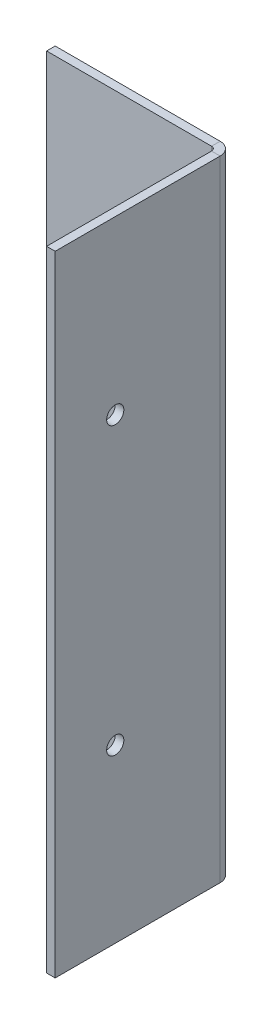
ISO-10303-21;
HEADER;
FILE_DESCRIPTION(('STEP AP214'),'2;1');
FILE_NAME('part.step','',(''),(''),'','','');
FILE_SCHEMA(('AUTOMOTIVE_DESIGN { 1 0 10303 214 1 1 1 1 }'));
ENDSEC;
DATA;
#1=APPLICATION_CONTEXT('core data for automotive mechanical design processes');
#2=APPLICATION_PROTOCOL_DEFINITION('international standard','automotive_design',2000,#1);
#3=PRODUCT_CONTEXT('',#1,'mechanical');
#4=PRODUCT('Part','Part','',(#3));
#5=PRODUCT_RELATED_PRODUCT_CATEGORY('part','',(#4));
#6=PRODUCT_DEFINITION_FORMATION('','',#4);
#7=PRODUCT_DEFINITION_CONTEXT('part definition',#1,'design');
#8=PRODUCT_DEFINITION('design','',#6,#7);
#9=PRODUCT_DEFINITION_SHAPE('','',#8);
#10=(LENGTH_UNIT() NAMED_UNIT(*) SI_UNIT(.MILLI.,.METRE.));
#11=(NAMED_UNIT(*) PLANE_ANGLE_UNIT() SI_UNIT($,.RADIAN.));
#12=(NAMED_UNIT(*) SI_UNIT($,.STERADIAN.) SOLID_ANGLE_UNIT());
#13=UNCERTAINTY_MEASURE_WITH_UNIT(LENGTH_MEASURE(1.E-05),#10,'distance_accuracy_value','');
#14=(GEOMETRIC_REPRESENTATION_CONTEXT(3) GLOBAL_UNCERTAINTY_ASSIGNED_CONTEXT((#13)) GLOBAL_UNIT_ASSIGNED_CONTEXT((#10,
#11,#12)) REPRESENTATION_CONTEXT('',''));
#15=CARTESIAN_POINT('',(0.,0.,0.));
#16=DIRECTION('',(0.,0.,1.));
#17=DIRECTION('',(1.,0.,0.));
#18=AXIS2_PLACEMENT_3D('',#15,#16,#17);
#19=CARTESIAN_POINT('',(29.5690270902935,0.,-30.4309729097067));
#20=DIRECTION('',(1.,0.,0.));
#21=DIRECTION('',(0.,0.,-1.));
#22=AXIS2_PLACEMENT_3D('',#19,#20,#21);
#23=PLANE('',#22);
#24=CARTESIAN_POINT('',(29.5690270902933,80.,19.0670308100559));
#25=DIRECTION('',(-1.,0.,0.));
#26=DIRECTION('',(0.,0.,1.));
#27=AXIS2_PLACEMENT_3D('',#24,#25,#26);
#28=CIRCLE('',#27,1.5);
#29=CARTESIAN_POINT('',(29.5690270902933,80.,20.5670308100559));
#30=VERTEX_POINT('',#29);
#31=EDGE_CURVE('E381',#30,#30,#28,.T.);
#32=ORIENTED_EDGE('',*,*,#31,.F.);
#33=EDGE_LOOP('',(#32));
#34=FACE_BOUND('',#33,.T.);
#35=CARTESIAN_POINT('',(29.5690270902933,30.,19.0670308100559));
#36=DIRECTION('',(-1.,0.,0.));
#37=DIRECTION('',(0.,0.,1.));
#38=AXIS2_PLACEMENT_3D('',#35,#36,#37);
#39=CIRCLE('',#38,1.5);
#40=CARTESIAN_POINT('',(29.5690270902933,30.,20.5670308100559));
#41=VERTEX_POINT('',#40);
#42=EDGE_CURVE('E383',#41,#41,#39,.T.);
#43=ORIENTED_EDGE('',*,*,#42,.F.);
#44=EDGE_LOOP('',(#43));
#45=FACE_BOUND('',#44,.T.);
#46=DIRECTION('',(0.,0.,-1.));
#47=VECTOR('',#46,1.);
#48=CARTESIAN_POINT('',(29.5690270902934,110.,-30.4309729097066));
#49=LINE('',#48,#47);
#50=CARTESIAN_POINT('',(29.5690270902932,110.,29.5690270902934));
#51=VERTEX_POINT('',#50);
#52=CARTESIAN_POINT('',(29.5690270902933,110.,0.736600000000014));
#53=VERTEX_POINT('',#52);
#54=EDGE_CURVE('E57',#51,#53,#49,.T.);
#55=ORIENTED_EDGE('',*,*,#54,.T.);
#56=DIRECTION('',(0.,-1.,0.));
#57=VECTOR('',#56,1.);
#58=CARTESIAN_POINT('',(29.5690270902934,0.,0.736600000000007));
#59=LINE('',#58,#57);
#60=CARTESIAN_POINT('',(29.5690270902934,0.,0.7366));
#61=VERTEX_POINT('',#60);
#62=EDGE_CURVE('E49',#53,#61,#59,.T.);
#63=ORIENTED_EDGE('',*,*,#62,.T.);
#64=DIRECTION('',(0.,0.,1.));
#65=VECTOR('',#64,1.);
#66=CARTESIAN_POINT('',(29.5690270902935,0.,-30.4309729097067));
#67=LINE('',#66,#65);
#68=CARTESIAN_POINT('',(29.5690270902933,0.,29.5690270902933));
#69=VERTEX_POINT('',#68);
#70=EDGE_CURVE('E65',#61,#69,#67,.T.);
#71=ORIENTED_EDGE('',*,*,#70,.T.);
#72=DIRECTION('',(0.,1.,0.));
#73=VECTOR('',#72,1.);
#74=CARTESIAN_POINT('',(29.5690270902933,0.,29.5690270902933));
#75=LINE('',#74,#73);
#76=EDGE_CURVE('E155',#69,#51,#75,.T.);
#77=ORIENTED_EDGE('',*,*,#76,.T.);
#78=EDGE_LOOP('',(#55,#63,#71,#77));
#79=FACE_BOUND('',#78,.T.);
#80=ADVANCED_FACE('F40',(#34,#45,#79),#23,.F.);
#81=CARTESIAN_POINT('',(31.0690270902935,110.,-30.4309729097066));
#82=DIRECTION('',(0.,1.,0.));
#83=DIRECTION('',(-1.,0.,0.));
#84=AXIS2_PLACEMENT_3D('',#81,#82,#83);
#85=PLANE('',#84);
#86=DIRECTION('',(1.,0.,0.));
#87=VECTOR('',#86,1.);
#88=CARTESIAN_POINT('',(31.0690270902933,110.,0.736600000000014));
#89=LINE('',#88,#87);
#90=CARTESIAN_POINT('',(31.0690270902933,110.,0.736600000000021));
#91=VERTEX_POINT('',#90);
#92=EDGE_CURVE('E12',#53,#91,#89,.T.);
#93=ORIENTED_EDGE('',*,*,#92,.F.);
#94=ORIENTED_EDGE('',*,*,#54,.F.);
#95=DIRECTION('',(-1.,0.,0.));
#96=VECTOR('',#95,1.);
#97=CARTESIAN_POINT('',(31.0690270902932,110.,29.5690270902934));
#98=LINE('',#97,#96);
#99=CARTESIAN_POINT('',(31.0690270902932,110.,29.5690270902934));
#100=VERTEX_POINT('',#99);
#101=EDGE_CURVE('E157',#100,#51,#98,.T.);
#102=ORIENTED_EDGE('',*,*,#101,.F.);
#103=DIRECTION('',(0.,0.,-1.));
#104=VECTOR('',#103,1.);
#105=CARTESIAN_POINT('',(31.0690270902935,110.,-30.4309729097066));
#106=LINE('',#105,#104);
#107=EDGE_CURVE('E154',#100,#91,#106,.T.);
#108=ORIENTED_EDGE('',*,*,#107,.T.);
#109=EDGE_LOOP('',(#93,#94,#102,#108));
#110=FACE_BOUND('',#109,.T.);
#111=ADVANCED_FACE('F42',(#110),#85,.T.);
#112=CARTESIAN_POINT('',(31.0690270902933,0.,29.5690270902933));
#113=DIRECTION('',(0.,0.,1.));
#114=DIRECTION('',(1.,0.,0.));
#115=AXIS2_PLACEMENT_3D('',#112,#113,#114);
#116=PLANE('',#115);
#117=ORIENTED_EDGE('',*,*,#76,.F.);
#118=DIRECTION('',(-1.,0.,0.));
#119=VECTOR('',#118,1.);
#120=CARTESIAN_POINT('',(31.0690270902933,0.,29.5690270902933));
#121=LINE('',#120,#119);
#122=CARTESIAN_POINT('',(31.0690270902933,0.,29.5690270902933));
#123=VERTEX_POINT('',#122);
#124=EDGE_CURVE('E159',#123,#69,#121,.T.);
#125=ORIENTED_EDGE('',*,*,#124,.F.);
#126=DIRECTION('',(0.,1.,0.));
#127=VECTOR('',#126,1.);
#128=CARTESIAN_POINT('',(31.0690270902933,0.,29.5690270902933));
#129=LINE('',#128,#127);
#130=EDGE_CURVE('E151',#123,#100,#129,.T.);
#131=ORIENTED_EDGE('',*,*,#130,.T.);
#132=ORIENTED_EDGE('',*,*,#101,.T.);
#133=EDGE_LOOP('',(#117,#125,#131,#132));
#134=FACE_BOUND('',#133,.T.);
#135=ADVANCED_FACE('F175',(#134),#116,.T.);
#136=CARTESIAN_POINT('',(31.0690270902935,0.,-30.4309729097066));
#137=DIRECTION('',(0.,-1.,0.));
#138=DIRECTION('',(1.,0.,0.));
#139=AXIS2_PLACEMENT_3D('',#136,#137,#138);
#140=PLANE('',#139);
#141=DIRECTION('',(-1.,0.,0.));
#142=VECTOR('',#141,1.);
#143=CARTESIAN_POINT('',(31.0690270902934,0.,0.736600000000014));
#144=LINE('',#143,#142);
#145=CARTESIAN_POINT('',(31.0690270902934,0.,0.736599999999997));
#146=VERTEX_POINT('',#145);
#147=EDGE_CURVE('E162',#146,#61,#144,.T.);
#148=ORIENTED_EDGE('',*,*,#147,.F.);
#149=DIRECTION('',(0.,0.,1.));
#150=VECTOR('',#149,1.);
#151=CARTESIAN_POINT('',(31.0690270902935,0.,-30.4309729097066));
#152=LINE('',#151,#150);
#153=EDGE_CURVE('E44',#146,#123,#152,.T.);
#154=ORIENTED_EDGE('',*,*,#153,.T.);
#155=ORIENTED_EDGE('',*,*,#124,.T.);
#156=ORIENTED_EDGE('',*,*,#70,.F.);
#157=EDGE_LOOP('',(#148,#154,#155,#156));
#158=FACE_BOUND('',#157,.T.);
#159=ADVANCED_FACE('F170',(#158),#140,.T.);
#160=CARTESIAN_POINT('',(31.0690270902935,0.,-30.4309729097066));
#161=DIRECTION('',(1.,0.,0.));
#162=DIRECTION('',(0.,0.,-1.));
#163=AXIS2_PLACEMENT_3D('',#160,#161,#162);
#164=PLANE('',#163);
#165=CARTESIAN_POINT('',(31.0690270902934,80.,19.0670308100559));
#166=DIRECTION('',(-1.,0.,0.));
#167=DIRECTION('',(0.,0.,1.));
#168=AXIS2_PLACEMENT_3D('',#165,#166,#167);
#169=CIRCLE('',#168,1.5);
#170=CARTESIAN_POINT('',(31.0690270902934,80.,20.5670308100559));
#171=VERTEX_POINT('',#170);
#172=EDGE_CURVE('E379',#171,#171,#169,.T.);
#173=ORIENTED_EDGE('',*,*,#172,.T.);
#174=EDGE_LOOP('',(#173));
#175=FACE_BOUND('',#174,.T.);
#176=CARTESIAN_POINT('',(31.0690270902934,30.,19.0670308100559));
#177=DIRECTION('',(-1.,0.,0.));
#178=DIRECTION('',(0.,0.,1.));
#179=AXIS2_PLACEMENT_3D('',#176,#177,#178);
#180=CIRCLE('',#179,1.5);
#181=CARTESIAN_POINT('',(31.0690270902934,30.,20.5670308100559));
#182=VERTEX_POINT('',#181);
#183=EDGE_CURVE('E188',#182,#182,#180,.T.);
#184=ORIENTED_EDGE('',*,*,#183,.T.);
#185=EDGE_LOOP('',(#184));
#186=FACE_BOUND('',#185,.T.);
#187=DIRECTION('',(0.,-1.,0.));
#188=VECTOR('',#187,1.);
#189=CARTESIAN_POINT('',(31.0690270902934,0.,0.736600000000014));
#190=LINE('',#189,#188);
#191=EDGE_CURVE('E129',#91,#146,#190,.T.);
#192=ORIENTED_EDGE('',*,*,#191,.F.);
#193=ORIENTED_EDGE('',*,*,#107,.F.);
#194=ORIENTED_EDGE('',*,*,#130,.F.);
#195=ORIENTED_EDGE('',*,*,#153,.F.);
#196=EDGE_LOOP('',(#192,#193,#194,#195));
#197=FACE_BOUND('',#196,.T.);
#198=ADVANCED_FACE('F177',(#175,#186,#197),#164,.T.);
#199=CARTESIAN_POINT('',(0.,0.,-1.5));
#200=DIRECTION('',(-1.,0.,0.));
#201=DIRECTION('',(0.,0.,1.));
#202=AXIS2_PLACEMENT_3D('',#199,#200,#201);
#203=PLANE('',#202);
#204=DIRECTION('',(0.,-1.,0.));
#205=VECTOR('',#204,1.);
#206=CARTESIAN_POINT('',(0.,0.,0.));
#207=LINE('',#206,#205);
#208=CARTESIAN_POINT('',(0.,110.,0.));
#209=VERTEX_POINT('',#208);
#210=CARTESIAN_POINT('',(0.,0.,0.));
#211=VERTEX_POINT('',#210);
#212=EDGE_CURVE('E200',#209,#211,#207,.T.);
#213=ORIENTED_EDGE('',*,*,#212,.F.);
#214=DIRECTION('',(0.,0.,1.));
#215=VECTOR('',#214,1.);
#216=CARTESIAN_POINT('',(0.,110.,-1.5));
#217=LINE('',#216,#215);
#218=CARTESIAN_POINT('',(0.,110.,-1.5));
#219=VERTEX_POINT('',#218);
#220=EDGE_CURVE('E167',#219,#209,#217,.T.);
#221=ORIENTED_EDGE('',*,*,#220,.F.);
#222=DIRECTION('',(0.,-1.,0.));
#223=VECTOR('',#222,1.);
#224=CARTESIAN_POINT('',(0.,0.,-1.5));
#225=LINE('',#224,#223);
#226=CARTESIAN_POINT('',(0.,0.,-1.5));
#227=VERTEX_POINT('',#226);
#228=EDGE_CURVE('E148',#219,#227,#225,.T.);
#229=ORIENTED_EDGE('',*,*,#228,.T.);
#230=DIRECTION('',(0.,0.,1.));
#231=VECTOR('',#230,1.);
#232=CARTESIAN_POINT('',(0.,0.,-1.5));
#233=LINE('',#232,#231);
#234=EDGE_CURVE('E141',#227,#211,#233,.T.);
#235=ORIENTED_EDGE('',*,*,#234,.T.);
#236=EDGE_LOOP('',(#213,#221,#229,#235));
#237=FACE_BOUND('',#236,.T.);
#238=ADVANCED_FACE('F211',(#237),#203,.T.);
#239=CARTESIAN_POINT('',(0.,0.,-1.5));
#240=DIRECTION('',(0.,0.,-1.));
#241=DIRECTION('',(-1.,0.,0.));
#242=AXIS2_PLACEMENT_3D('',#239,#240,#241);
#243=PLANE('',#242);
#244=DIRECTION('',(-1.,0.,0.));
#245=VECTOR('',#244,1.);
#246=CARTESIAN_POINT('',(0.,110.,-1.5));
#247=LINE('',#246,#245);
#248=CARTESIAN_POINT('',(28.8324270902934,110.,-1.5));
#249=VERTEX_POINT('',#248);
#250=EDGE_CURVE('E139',#249,#219,#247,.T.);
#251=ORIENTED_EDGE('',*,*,#250,.F.);
#252=DIRECTION('',(0.,-1.,0.));
#253=VECTOR('',#252,1.);
#254=CARTESIAN_POINT('',(28.8324270902934,0.,-1.5));
#255=LINE('',#254,#253);
#256=CARTESIAN_POINT('',(28.8324270902934,1.11022302462516E-13,-1.5));
#257=VERTEX_POINT('',#256);
#258=EDGE_CURVE('E127',#249,#257,#255,.T.);
#259=ORIENTED_EDGE('',*,*,#258,.T.);
#260=DIRECTION('',(1.,0.,0.));
#261=VECTOR('',#260,1.);
#262=CARTESIAN_POINT('',(0.,0.,-1.5));
#263=LINE('',#262,#261);
#264=EDGE_CURVE('E120',#227,#257,#263,.T.);
#265=ORIENTED_EDGE('',*,*,#264,.F.);
#266=ORIENTED_EDGE('',*,*,#228,.F.);
#267=EDGE_LOOP('',(#251,#259,#265,#266));
#268=FACE_BOUND('',#267,.T.);
#269=ADVANCED_FACE('F136',(#268),#243,.T.);
#270=CARTESIAN_POINT('',(0.,0.,-1.5));
#271=DIRECTION('',(0.,-1.,0.));
#272=DIRECTION('',(0.,0.,-1.));
#273=AXIS2_PLACEMENT_3D('',#270,#271,#272);
#274=PLANE('',#273);
#275=ORIENTED_EDGE('',*,*,#264,.T.);
#276=DIRECTION('',(0.,0.,1.));
#277=VECTOR('',#276,1.);
#278=CARTESIAN_POINT('',(28.8324270902934,0.,-1.5));
#279=LINE('',#278,#277);
#280=CARTESIAN_POINT('',(28.8324270902934,0.,0.));
#281=VERTEX_POINT('',#280);
#282=EDGE_CURVE('E108',#257,#281,#279,.T.);
#283=ORIENTED_EDGE('',*,*,#282,.T.);
#284=DIRECTION('',(1.,0.,0.));
#285=VECTOR('',#284,1.);
#286=CARTESIAN_POINT('',(0.,0.,0.));
#287=LINE('',#286,#285);
#288=EDGE_CURVE('E197',#211,#281,#287,.T.);
#289=ORIENTED_EDGE('',*,*,#288,.F.);
#290=ORIENTED_EDGE('',*,*,#234,.F.);
#291=EDGE_LOOP('',(#275,#283,#289,#290));
#292=FACE_BOUND('',#291,.T.);
#293=ADVANCED_FACE('F143',(#292),#274,.T.);
#294=CARTESIAN_POINT('',(0.,0.,0.));
#295=DIRECTION('',(0.,0.,-1.));
#296=DIRECTION('',(-1.,0.,0.));
#297=AXIS2_PLACEMENT_3D('',#294,#295,#296);
#298=PLANE('',#297);
#299=DIRECTION('',(0.,-1.,0.));
#300=VECTOR('',#299,1.);
#301=CARTESIAN_POINT('',(28.8324270902934,0.,0.));
#302=LINE('',#301,#300);
#303=CARTESIAN_POINT('',(28.8324270902934,110.,0.));
#304=VERTEX_POINT('',#303);
#305=EDGE_CURVE('E130',#304,#281,#302,.T.);
#306=ORIENTED_EDGE('',*,*,#305,.F.);
#307=DIRECTION('',(-1.,0.,0.));
#308=VECTOR('',#307,1.);
#309=CARTESIAN_POINT('',(0.,110.,0.));
#310=LINE('',#309,#308);
#311=EDGE_CURVE('E119',#304,#209,#310,.T.);
#312=ORIENTED_EDGE('',*,*,#311,.T.);
#313=ORIENTED_EDGE('',*,*,#212,.T.);
#314=ORIENTED_EDGE('',*,*,#288,.T.);
#315=EDGE_LOOP('',(#306,#312,#313,#314));
#316=FACE_BOUND('',#315,.T.);
#317=ADVANCED_FACE('F205',(#316),#298,.F.);
#318=CARTESIAN_POINT('',(0.,110.,-1.5));
#319=DIRECTION('',(0.,1.,0.));
#320=DIRECTION('',(0.,0.,1.));
#321=AXIS2_PLACEMENT_3D('',#318,#319,#320);
#322=PLANE('',#321);
#323=ORIENTED_EDGE('',*,*,#311,.F.);
#324=DIRECTION('',(0.,0.,-1.));
#325=VECTOR('',#324,1.);
#326=CARTESIAN_POINT('',(28.8324270902934,110.,-1.5));
#327=LINE('',#326,#325);
#328=EDGE_CURVE('E195',#304,#249,#327,.T.);
#329=ORIENTED_EDGE('',*,*,#328,.T.);
#330=ORIENTED_EDGE('',*,*,#250,.T.);
#331=ORIENTED_EDGE('',*,*,#220,.T.);
#332=EDGE_LOOP('',(#323,#329,#330,#331));
#333=FACE_BOUND('',#332,.T.);
#334=ADVANCED_FACE('F209',(#333),#322,.T.);
#335=CARTESIAN_POINT('',(28.8324270902934,110.,0.7366));
#336=DIRECTION('',(0.,1.,0.));
#337=DIRECTION('',(0.,0.,1.));
#338=AXIS2_PLACEMENT_3D('',#335,#336,#337);
#339=PLANE('',#338);
#340=ORIENTED_EDGE('',*,*,#328,.F.);
#341=CARTESIAN_POINT('',(28.8324270902934,110.,0.7366));
#342=DIRECTION('',(0.,-1.,0.));
#343=DIRECTION('',(1.,0.,0.));
#344=AXIS2_PLACEMENT_3D('',#341,#342,#343);
#345=CIRCLE('',#344,0.7366);
#346=EDGE_CURVE('E184',#304,#53,#345,.T.);
#347=ORIENTED_EDGE('',*,*,#346,.T.);
#348=ORIENTED_EDGE('',*,*,#92,.T.);
#349=CARTESIAN_POINT('',(28.8324270902934,110.,0.7366));
#350=DIRECTION('',(0.,-1.,0.));
#351=DIRECTION('',(0.,0.,1.));
#352=AXIS2_PLACEMENT_3D('',#349,#350,#351);
#353=CIRCLE('',#352,2.2366);
#354=EDGE_CURVE('E131',#249,#91,#353,.T.);
#355=ORIENTED_EDGE('',*,*,#354,.F.);
#356=EDGE_LOOP('',(#340,#347,#348,#355));
#357=FACE_BOUND('',#356,.T.);
#358=ADVANCED_FACE('F182',(#357),#339,.T.);
#359=CARTESIAN_POINT('',(28.8324270902934,0.,0.7366));
#360=DIRECTION('',(0.,-1.,0.));
#361=DIRECTION('',(1.,0.,0.));
#362=AXIS2_PLACEMENT_3D('',#359,#360,#361);
#363=PLANE('',#362);
#364=CARTESIAN_POINT('',(28.8324270902934,1.38777878078145E-13,0.7366));
#365=DIRECTION('',(0.,-1.,0.));
#366=DIRECTION('',(1.,0.,0.));
#367=AXIS2_PLACEMENT_3D('',#364,#365,#366);
#368=CIRCLE('',#367,0.7366);
#369=EDGE_CURVE('E114',#61,#281,#368,.F.);
#370=ORIENTED_EDGE('',*,*,#369,.T.);
#371=ORIENTED_EDGE('',*,*,#282,.F.);
#372=CARTESIAN_POINT('',(28.8324270902934,0.,0.7366));
#373=DIRECTION('',(0.,1.,0.));
#374=DIRECTION('',(1.,0.,0.));
#375=AXIS2_PLACEMENT_3D('',#372,#373,#374);
#376=CIRCLE('',#375,2.2366);
#377=EDGE_CURVE('E112',#146,#257,#376,.T.);
#378=ORIENTED_EDGE('',*,*,#377,.F.);
#379=ORIENTED_EDGE('',*,*,#147,.T.);
#380=EDGE_LOOP('',(#370,#371,#378,#379));
#381=FACE_BOUND('',#380,.T.);
#382=ADVANCED_FACE('F110',(#381),#363,.T.);
#383=CARTESIAN_POINT('',(28.8324270902933,165.035007638469,0.7366));
#384=DIRECTION('',(0.,-1.,0.));
#385=DIRECTION('',(1.,0.,0.));
#386=AXIS2_PLACEMENT_3D('',#383,#384,#385);
#387=CYLINDRICAL_SURFACE('',#386,2.2366);
#388=ORIENTED_EDGE('',*,*,#191,.T.);
#389=ORIENTED_EDGE('',*,*,#377,.T.);
#390=ORIENTED_EDGE('',*,*,#258,.F.);
#391=ORIENTED_EDGE('',*,*,#354,.T.);
#392=EDGE_LOOP('',(#388,#389,#390,#391));
#393=FACE_BOUND('',#392,.T.);
#394=ADVANCED_FACE('F125',(#393),#387,.T.);
#395=CARTESIAN_POINT('',(28.8324270902933,165.035007638469,0.7366));
#396=DIRECTION('',(0.,-1.,0.));
#397=DIRECTION('',(1.,0.,0.));
#398=AXIS2_PLACEMENT_3D('',#395,#396,#397);
#399=CYLINDRICAL_SURFACE('',#398,0.7366);
#400=ORIENTED_EDGE('',*,*,#62,.F.);
#401=ORIENTED_EDGE('',*,*,#346,.F.);
#402=ORIENTED_EDGE('',*,*,#305,.T.);
#403=ORIENTED_EDGE('',*,*,#369,.F.);
#404=EDGE_LOOP('',(#400,#401,#402,#403));
#405=FACE_BOUND('',#404,.T.);
#406=ADVANCED_FACE('F270',(#405),#399,.F.);
#407=CARTESIAN_POINT('',(29.5690270902933,30.,19.0670308100559));
#408=DIRECTION('',(-1.,0.,0.));
#409=DIRECTION('',(0.,0.,1.));
#410=AXIS2_PLACEMENT_3D('',#407,#408,#409);
#411=CYLINDRICAL_SURFACE('',#410,1.5);
#412=ORIENTED_EDGE('',*,*,#183,.F.);
#413=EDGE_LOOP('',(#412));
#414=FACE_BOUND('',#413,.T.);
#415=ORIENTED_EDGE('',*,*,#42,.T.);
#416=EDGE_LOOP('',(#415));
#417=FACE_BOUND('',#416,.T.);
#418=ADVANCED_FACE('F276',(#414,#417),#411,.F.);
#419=CARTESIAN_POINT('',(29.5690270902933,80.,19.0670308100559));
#420=DIRECTION('',(-1.,0.,0.));
#421=DIRECTION('',(0.,0.,1.));
#422=AXIS2_PLACEMENT_3D('',#419,#420,#421);
#423=CYLINDRICAL_SURFACE('',#422,1.5);
#424=ORIENTED_EDGE('',*,*,#172,.F.);
#425=EDGE_LOOP('',(#424));
#426=FACE_BOUND('',#425,.T.);
#427=ORIENTED_EDGE('',*,*,#31,.T.);
#428=EDGE_LOOP('',(#427));
#429=FACE_BOUND('',#428,.T.);
#430=ADVANCED_FACE('F284',(#426,#429),#423,.F.);
#431=CLOSED_SHELL('',(#80,#111,#135,#159,#198,#238,#269,#293,#317,#334,#358,#382,#394,#406,#418,#430));
#432=MANIFOLD_SOLID_BREP('B2',#431);
#433=ADVANCED_BREP_SHAPE_REPRESENTATION('',(#18,#432),#14);
#434=SHAPE_DEFINITION_REPRESENTATION(#9,#433);
ENDSEC;
END-ISO-10303-21;
